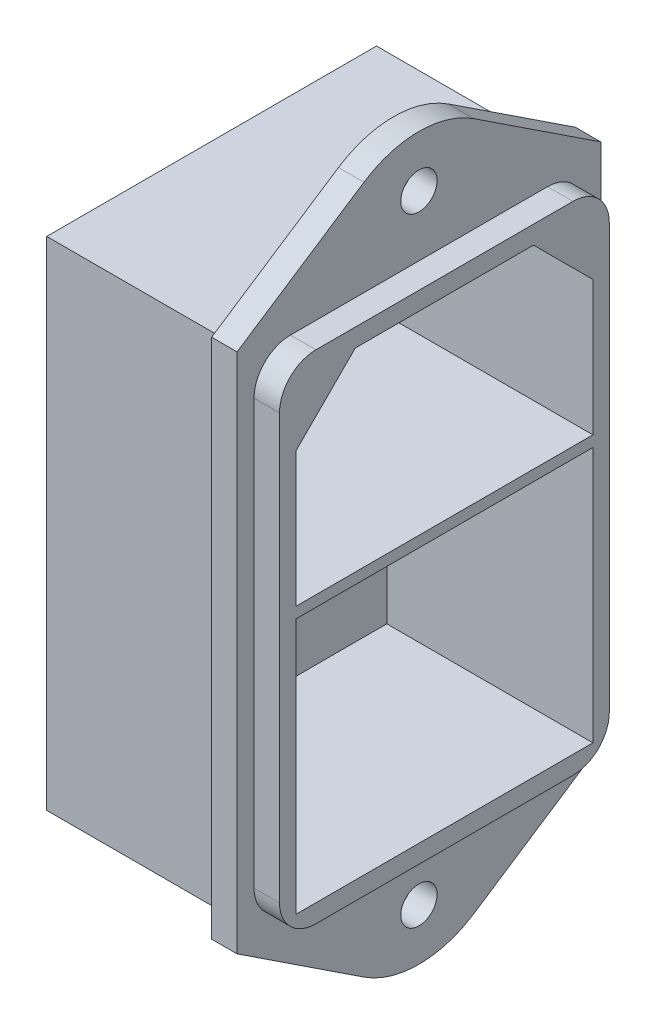
ISO-10303-21;
HEADER;
FILE_DESCRIPTION(('STEP AP214'),'2;1');
FILE_NAME('part.step','',(''),(''),'','','');
FILE_SCHEMA(('AUTOMOTIVE_DESIGN { 1 0 10303 214 1 1 1 1 }'));
ENDSEC;
DATA;
#1=APPLICATION_CONTEXT('core data for automotive mechanical design processes');
#2=APPLICATION_PROTOCOL_DEFINITION('international standard','automotive_design',2000,#1);
#3=PRODUCT_CONTEXT('',#1,'mechanical');
#4=PRODUCT('Part','Part','',(#3));
#5=PRODUCT_RELATED_PRODUCT_CATEGORY('part','',(#4));
#6=PRODUCT_DEFINITION_FORMATION('','',#4);
#7=PRODUCT_DEFINITION_CONTEXT('part definition',#1,'design');
#8=PRODUCT_DEFINITION('design','',#6,#7);
#9=PRODUCT_DEFINITION_SHAPE('','',#8);
#10=(LENGTH_UNIT() NAMED_UNIT(*) SI_UNIT(.MILLI.,.METRE.));
#11=(NAMED_UNIT(*) PLANE_ANGLE_UNIT() SI_UNIT($,.RADIAN.));
#12=(NAMED_UNIT(*) SI_UNIT($,.STERADIAN.) SOLID_ANGLE_UNIT());
#13=UNCERTAINTY_MEASURE_WITH_UNIT(LENGTH_MEASURE(1.E-05),#10,'distance_accuracy_value','');
#14=(GEOMETRIC_REPRESENTATION_CONTEXT(3) GLOBAL_UNCERTAINTY_ASSIGNED_CONTEXT((#13)) GLOBAL_UNIT_ASSIGNED_CONTEXT((#10,
#11,#12)) REPRESENTATION_CONTEXT('',''));
#15=CARTESIAN_POINT('',(0.,0.,0.));
#16=DIRECTION('',(0.,0.,1.));
#17=DIRECTION('',(1.,0.,0.));
#18=AXIS2_PLACEMENT_3D('',#15,#16,#17);
#19=CARTESIAN_POINT('',(2.1,2.09999999999999,0.));
#20=DIRECTION('',(0.,1.,0.));
#21=DIRECTION('',(0.,0.,1.));
#22=AXIS2_PLACEMENT_3D('',#19,#20,#21);
#23=PLANE('',#22);
#24=DIRECTION('',(0.,0.,1.));
#25=VECTOR('',#24,1.);
#26=CARTESIAN_POINT('',(-12.8,2.09999999999999,0.));
#27=LINE('',#26,#25);
#28=CARTESIAN_POINT('',(-12.8,2.09999999999999,-12.25));
#29=VERTEX_POINT('',#28);
#30=CARTESIAN_POINT('',(-12.8,2.09999999999999,12.25));
#31=VERTEX_POINT('',#30);
#32=EDGE_CURVE('E106',#29,#31,#27,.T.);
#33=ORIENTED_EDGE('',*,*,#32,.F.);
#34=DIRECTION('',(-1.,0.,0.));
#35=VECTOR('',#34,1.);
#36=CARTESIAN_POINT('',(2.1,2.09999999999999,-12.25));
#37=LINE('',#36,#35);
#38=CARTESIAN_POINT('',(4.2,2.09999999999999,-12.25));
#39=VERTEX_POINT('',#38);
#40=EDGE_CURVE('E296',#39,#29,#37,.T.);
#41=ORIENTED_EDGE('',*,*,#40,.F.);
#42=DIRECTION('',(0.,0.,1.));
#43=VECTOR('',#42,1.);
#44=CARTESIAN_POINT('',(4.2,2.09999999999999,0.));
#45=LINE('',#44,#43);
#46=CARTESIAN_POINT('',(4.2,2.09999999999999,12.25));
#47=VERTEX_POINT('',#46);
#48=EDGE_CURVE('E562',#39,#47,#45,.T.);
#49=ORIENTED_EDGE('',*,*,#48,.T.);
#50=DIRECTION('',(-1.,0.,0.));
#51=VECTOR('',#50,1.);
#52=CARTESIAN_POINT('',(2.1,2.09999999999999,12.25));
#53=LINE('',#52,#51);
#54=EDGE_CURVE('E298',#47,#31,#53,.T.);
#55=ORIENTED_EDGE('',*,*,#54,.T.);
#56=EDGE_LOOP('',(#33,#41,#49,#55));
#57=FACE_BOUND('',#56,.T.);
#58=ADVANCED_FACE('F91',(#57),#23,.F.);
#59=CARTESIAN_POINT('',(2.1,0.,-12.25));
#60=DIRECTION('',(0.,0.,-1.));
#61=DIRECTION('',(-1.,0.,0.));
#62=AXIS2_PLACEMENT_3D('',#59,#60,#61);
#63=PLANE('',#62);
#64=DIRECTION('',(0.,1.,0.));
#65=VECTOR('',#64,1.);
#66=CARTESIAN_POINT('',(-12.8,0.,-12.25));
#67=LINE('',#66,#65);
#68=CARTESIAN_POINT('',(-12.8,-19.,-12.25));
#69=VERTEX_POINT('',#68);
#70=EDGE_CURVE('E285',#69,#29,#67,.T.);
#71=ORIENTED_EDGE('',*,*,#70,.F.);
#72=DIRECTION('',(-1.,0.,0.));
#73=VECTOR('',#72,1.);
#74=CARTESIAN_POINT('',(2.1,-19.,-12.25));
#75=LINE('',#74,#73);
#76=CARTESIAN_POINT('',(4.2,-19.,-12.25));
#77=VERTEX_POINT('',#76);
#78=EDGE_CURVE('E307',#77,#69,#75,.T.);
#79=ORIENTED_EDGE('',*,*,#78,.F.);
#80=DIRECTION('',(0.,1.,0.));
#81=VECTOR('',#80,1.);
#82=CARTESIAN_POINT('',(4.2,0.,-12.25));
#83=LINE('',#82,#81);
#84=EDGE_CURVE('E304',#77,#39,#83,.T.);
#85=ORIENTED_EDGE('',*,*,#84,.T.);
#86=ORIENTED_EDGE('',*,*,#40,.T.);
#87=EDGE_LOOP('',(#71,#79,#85,#86));
#88=FACE_BOUND('',#87,.T.);
#89=ADVANCED_FACE('F302',(#88),#63,.F.);
#90=CARTESIAN_POINT('',(2.1,-19.,0.));
#91=DIRECTION('',(0.,1.,0.));
#92=DIRECTION('',(0.,0.,1.));
#93=AXIS2_PLACEMENT_3D('',#90,#91,#92);
#94=PLANE('',#93);
#95=ORIENTED_EDGE('',*,*,#78,.T.);
#96=DIRECTION('',(0.,0.,1.));
#97=VECTOR('',#96,1.);
#98=CARTESIAN_POINT('',(-12.8,-19.,0.));
#99=LINE('',#98,#97);
#100=CARTESIAN_POINT('',(-12.8,-19.,12.25));
#101=VERTEX_POINT('',#100);
#102=EDGE_CURVE('E288',#69,#101,#99,.T.);
#103=ORIENTED_EDGE('',*,*,#102,.T.);
#104=DIRECTION('',(-1.,0.,0.));
#105=VECTOR('',#104,1.);
#106=CARTESIAN_POINT('',(2.1,-19.,12.25));
#107=LINE('',#106,#105);
#108=CARTESIAN_POINT('',(4.2,-19.,12.25));
#109=VERTEX_POINT('',#108);
#110=EDGE_CURVE('E311',#109,#101,#107,.T.);
#111=ORIENTED_EDGE('',*,*,#110,.F.);
#112=DIRECTION('',(0.,0.,1.));
#113=VECTOR('',#112,1.);
#114=CARTESIAN_POINT('',(4.2,-19.,0.));
#115=LINE('',#114,#113);
#116=EDGE_CURVE('E399',#77,#109,#115,.T.);
#117=ORIENTED_EDGE('',*,*,#116,.F.);
#118=EDGE_LOOP('',(#95,#103,#111,#117));
#119=FACE_BOUND('',#118,.T.);
#120=ADVANCED_FACE('F493',(#119),#94,.T.);
#121=CARTESIAN_POINT('',(2.1,0.,12.25));
#122=DIRECTION('',(0.,0.,-1.));
#123=DIRECTION('',(0.,1.,0.));
#124=AXIS2_PLACEMENT_3D('',#121,#122,#123);
#125=PLANE('',#124);
#126=ORIENTED_EDGE('',*,*,#110,.T.);
#127=DIRECTION('',(0.,1.,0.));
#128=VECTOR('',#127,1.);
#129=CARTESIAN_POINT('',(-12.8,0.,12.25));
#130=LINE('',#129,#128);
#131=EDGE_CURVE('E300',#101,#31,#130,.T.);
#132=ORIENTED_EDGE('',*,*,#131,.T.);
#133=ORIENTED_EDGE('',*,*,#54,.F.);
#134=DIRECTION('',(0.,1.,0.));
#135=VECTOR('',#134,1.);
#136=CARTESIAN_POINT('',(4.2,0.,12.25));
#137=LINE('',#136,#135);
#138=EDGE_CURVE('E489',#109,#47,#137,.T.);
#139=ORIENTED_EDGE('',*,*,#138,.F.);
#140=EDGE_LOOP('',(#126,#132,#133,#139));
#141=FACE_BOUND('',#140,.T.);
#142=ADVANCED_FACE('F487',(#141),#125,.T.);
#143=CARTESIAN_POINT('',(2.1,0.,12.25));
#144=DIRECTION('',(0.,0.,-1.));
#145=DIRECTION('',(0.,1.,0.));
#146=AXIS2_PLACEMENT_3D('',#143,#144,#145);
#147=PLANE('',#146);
#148=DIRECTION('',(-1.,0.,0.));
#149=VECTOR('',#148,1.);
#150=CARTESIAN_POINT('',(2.1,2.99999999999999,12.25));
#151=LINE('',#150,#149);
#152=CARTESIAN_POINT('',(4.2,2.99999999999999,12.25));
#153=VERTEX_POINT('',#152);
#154=CARTESIAN_POINT('',(-12.8,2.99999999999999,12.25));
#155=VERTEX_POINT('',#154);
#156=EDGE_CURVE('E315',#153,#155,#151,.T.);
#157=ORIENTED_EDGE('',*,*,#156,.T.);
#158=DIRECTION('',(0.,1.,0.));
#159=VECTOR('',#158,1.);
#160=CARTESIAN_POINT('',(-12.8,0.,12.25));
#161=LINE('',#160,#159);
#162=CARTESIAN_POINT('',(-12.8,14.1,12.25));
#163=VERTEX_POINT('',#162);
#164=EDGE_CURVE('E114',#155,#163,#161,.T.);
#165=ORIENTED_EDGE('',*,*,#164,.T.);
#166=DIRECTION('',(-1.,0.,0.));
#167=VECTOR('',#166,1.);
#168=CARTESIAN_POINT('',(2.1,14.1,12.25));
#169=LINE('',#168,#167);
#170=CARTESIAN_POINT('',(4.2,14.1,12.25));
#171=VERTEX_POINT('',#170);
#172=EDGE_CURVE('E331',#171,#163,#169,.T.);
#173=ORIENTED_EDGE('',*,*,#172,.F.);
#174=DIRECTION('',(0.,1.,0.));
#175=VECTOR('',#174,1.);
#176=CARTESIAN_POINT('',(4.2,0.,12.25));
#177=LINE('',#176,#175);
#178=EDGE_CURVE('E549',#153,#171,#177,.T.);
#179=ORIENTED_EDGE('',*,*,#178,.F.);
#180=EDGE_LOOP('',(#157,#165,#173,#179));
#181=FACE_BOUND('',#180,.T.);
#182=ADVANCED_FACE('F620',(#181),#147,.T.);
#183=CARTESIAN_POINT('',(2.1,13.175,13.175));
#184=DIRECTION('',(0.,-0.707106781186547,-0.707106781186548));
#185=DIRECTION('',(0.,0.707106781186548,-0.707106781186547));
#186=AXIS2_PLACEMENT_3D('',#183,#184,#185);
#187=PLANE('',#186);
#188=ORIENTED_EDGE('',*,*,#172,.T.);
#189=DIRECTION('',(0.,0.707106781186548,-0.707106781186547));
#190=VECTOR('',#189,1.);
#191=CARTESIAN_POINT('',(-12.8,13.175,13.175));
#192=LINE('',#191,#190);
#193=CARTESIAN_POINT('',(-12.8,19.,7.35000000000001));
#194=VERTEX_POINT('',#193);
#195=EDGE_CURVE('E503',#163,#194,#192,.T.);
#196=ORIENTED_EDGE('',*,*,#195,.T.);
#197=DIRECTION('',(-1.,0.,0.));
#198=VECTOR('',#197,1.);
#199=CARTESIAN_POINT('',(2.1,19.,7.35000000000001));
#200=LINE('',#199,#198);
#201=CARTESIAN_POINT('',(4.2,19.,7.35000000000001));
#202=VERTEX_POINT('',#201);
#203=EDGE_CURVE('E328',#202,#194,#200,.T.);
#204=ORIENTED_EDGE('',*,*,#203,.F.);
#205=DIRECTION('',(0.,0.707106781186548,-0.707106781186547));
#206=VECTOR('',#205,1.);
#207=CARTESIAN_POINT('',(4.2,13.175,13.175));
#208=LINE('',#207,#206);
#209=EDGE_CURVE('E552',#171,#202,#208,.T.);
#210=ORIENTED_EDGE('',*,*,#209,.F.);
#211=EDGE_LOOP('',(#188,#196,#204,#210));
#212=FACE_BOUND('',#211,.T.);
#213=ADVANCED_FACE('F616',(#212),#187,.T.);
#214=CARTESIAN_POINT('',(2.1,19.,0.));
#215=DIRECTION('',(0.,-1.,0.));
#216=DIRECTION('',(0.,0.,-1.));
#217=AXIS2_PLACEMENT_3D('',#214,#215,#216);
#218=PLANE('',#217);
#219=ORIENTED_EDGE('',*,*,#203,.T.);
#220=DIRECTION('',(0.,0.,-1.));
#221=VECTOR('',#220,1.);
#222=CARTESIAN_POINT('',(-12.8,19.,0.));
#223=LINE('',#222,#221);
#224=CARTESIAN_POINT('',(-12.8,19.,-7.35));
#225=VERTEX_POINT('',#224);
#226=EDGE_CURVE('E506',#194,#225,#223,.T.);
#227=ORIENTED_EDGE('',*,*,#226,.T.);
#228=DIRECTION('',(-1.,0.,0.));
#229=VECTOR('',#228,1.);
#230=CARTESIAN_POINT('',(2.1,19.,-7.35));
#231=LINE('',#230,#229);
#232=CARTESIAN_POINT('',(4.2,19.,-7.35));
#233=VERTEX_POINT('',#232);
#234=EDGE_CURVE('E325',#233,#225,#231,.T.);
#235=ORIENTED_EDGE('',*,*,#234,.F.);
#236=DIRECTION('',(0.,0.,-1.));
#237=VECTOR('',#236,1.);
#238=CARTESIAN_POINT('',(4.2,19.,0.));
#239=LINE('',#238,#237);
#240=EDGE_CURVE('E555',#202,#233,#239,.T.);
#241=ORIENTED_EDGE('',*,*,#240,.F.);
#242=EDGE_LOOP('',(#219,#227,#235,#241));
#243=FACE_BOUND('',#242,.T.);
#244=ADVANCED_FACE('F612',(#243),#218,.T.);
#245=CARTESIAN_POINT('',(2.1,13.175,-13.175));
#246=DIRECTION('',(0.,-0.707106781186548,0.707106781186548));
#247=DIRECTION('',(0.,-0.707106781186548,-0.707106781186548));
#248=AXIS2_PLACEMENT_3D('',#245,#246,#247);
#249=PLANE('',#248);
#250=ORIENTED_EDGE('',*,*,#234,.T.);
#251=DIRECTION('',(0.,-0.707106781186548,-0.707106781186548));
#252=VECTOR('',#251,1.);
#253=CARTESIAN_POINT('',(-12.8,13.175,-13.175));
#254=LINE('',#253,#252);
#255=CARTESIAN_POINT('',(-12.8,14.1,-12.25));
#256=VERTEX_POINT('',#255);
#257=EDGE_CURVE('E299',#225,#256,#254,.T.);
#258=ORIENTED_EDGE('',*,*,#257,.T.);
#259=DIRECTION('',(-1.,0.,0.));
#260=VECTOR('',#259,1.);
#261=CARTESIAN_POINT('',(2.1,14.1,-12.25));
#262=LINE('',#261,#260);
#263=CARTESIAN_POINT('',(4.2,14.1,-12.25));
#264=VERTEX_POINT('',#263);
#265=EDGE_CURVE('E322',#264,#256,#262,.T.);
#266=ORIENTED_EDGE('',*,*,#265,.F.);
#267=DIRECTION('',(0.,-0.707106781186548,-0.707106781186548));
#268=VECTOR('',#267,1.);
#269=CARTESIAN_POINT('',(4.2,13.175,-13.175));
#270=LINE('',#269,#268);
#271=EDGE_CURVE('E558',#233,#264,#270,.T.);
#272=ORIENTED_EDGE('',*,*,#271,.F.);
#273=EDGE_LOOP('',(#250,#258,#266,#272));
#274=FACE_BOUND('',#273,.T.);
#275=ADVANCED_FACE('F608',(#274),#249,.T.);
#276=CARTESIAN_POINT('',(2.1,0.,-12.25));
#277=DIRECTION('',(0.,0.,1.));
#278=DIRECTION('',(0.,-1.,0.));
#279=AXIS2_PLACEMENT_3D('',#276,#277,#278);
#280=PLANE('',#279);
#281=ORIENTED_EDGE('',*,*,#265,.T.);
#282=DIRECTION('',(0.,-1.,0.));
#283=VECTOR('',#282,1.);
#284=CARTESIAN_POINT('',(-12.8,0.,-12.25));
#285=LINE('',#284,#283);
#286=CARTESIAN_POINT('',(-12.8,2.99999999999999,-12.25));
#287=VERTEX_POINT('',#286);
#288=EDGE_CURVE('E497',#256,#287,#285,.T.);
#289=ORIENTED_EDGE('',*,*,#288,.T.);
#290=DIRECTION('',(-1.,0.,0.));
#291=VECTOR('',#290,1.);
#292=CARTESIAN_POINT('',(2.1,2.99999999999999,-12.25));
#293=LINE('',#292,#291);
#294=CARTESIAN_POINT('',(4.2,2.99999999999999,-12.25));
#295=VERTEX_POINT('',#294);
#296=EDGE_CURVE('E318',#295,#287,#293,.T.);
#297=ORIENTED_EDGE('',*,*,#296,.F.);
#298=DIRECTION('',(0.,-1.,0.));
#299=VECTOR('',#298,1.);
#300=CARTESIAN_POINT('',(4.2,0.,-12.25));
#301=LINE('',#300,#299);
#302=EDGE_CURVE('E535',#264,#295,#301,.T.);
#303=ORIENTED_EDGE('',*,*,#302,.F.);
#304=EDGE_LOOP('',(#281,#289,#297,#303));
#305=FACE_BOUND('',#304,.T.);
#306=ADVANCED_FACE('F604',(#305),#280,.T.);
#307=CARTESIAN_POINT('',(2.1,2.99999999999999,0.));
#308=DIRECTION('',(0.,1.,0.));
#309=DIRECTION('',(0.,0.,1.));
#310=AXIS2_PLACEMENT_3D('',#307,#308,#309);
#311=PLANE('',#310);
#312=ORIENTED_EDGE('',*,*,#296,.T.);
#313=DIRECTION('',(0.,0.,1.));
#314=VECTOR('',#313,1.);
#315=CARTESIAN_POINT('',(-12.8,2.99999999999999,0.));
#316=LINE('',#315,#314);
#317=EDGE_CURVE('E500',#287,#155,#316,.T.);
#318=ORIENTED_EDGE('',*,*,#317,.T.);
#319=ORIENTED_EDGE('',*,*,#156,.F.);
#320=DIRECTION('',(0.,0.,1.));
#321=VECTOR('',#320,1.);
#322=CARTESIAN_POINT('',(4.2,2.99999999999999,0.));
#323=LINE('',#322,#321);
#324=EDGE_CURVE('E546',#295,#153,#323,.T.);
#325=ORIENTED_EDGE('',*,*,#324,.F.);
#326=EDGE_LOOP('',(#312,#318,#319,#325));
#327=FACE_BOUND('',#326,.T.);
#328=ADVANCED_FACE('F600',(#327),#311,.T.);
#329=CARTESIAN_POINT('',(0.,0.,0.));
#330=DIRECTION('',(1.,0.,0.));
#331=DIRECTION('',(0.,0.,-1.));
#332=AXIS2_PLACEMENT_3D('',#329,#330,#331);
#333=PLANE('',#332);
#334=CARTESIAN_POINT('',(0.,-25.5,0.));
#335=DIRECTION('',(1.,0.,0.));
#336=DIRECTION('',(0.,0.,-1.));
#337=AXIS2_PLACEMENT_3D('',#334,#335,#336);
#338=CIRCLE('',#337,1.5);
#339=CARTESIAN_POINT('',(0.,-25.5,-1.5));
#340=VERTEX_POINT('',#339);
#341=EDGE_CURVE('E434',#340,#340,#338,.F.);
#342=ORIENTED_EDGE('',*,*,#341,.F.);
#343=EDGE_LOOP('',(#342));
#344=FACE_BOUND('',#343,.T.);
#345=CARTESIAN_POINT('',(0.,21.5,0.));
#346=DIRECTION('',(1.,0.,0.));
#347=DIRECTION('',(0.,0.,-1.));
#348=AXIS2_PLACEMENT_3D('',#345,#346,#347);
#349=CIRCLE('',#348,8.25000000000001);
#350=CARTESIAN_POINT('',(0.,28.3901083990021,4.53750000000002));
#351=VERTEX_POINT('',#350);
#352=CARTESIAN_POINT('',(0.,28.3901083990021,-4.53749999999999));
#353=VERTEX_POINT('',#352);
#354=EDGE_CURVE('E418',#351,#353,#349,.F.);
#355=ORIENTED_EDGE('',*,*,#354,.T.);
#356=DIRECTION('',(0.,-0.55,-0.835164654424504));
#357=VECTOR('',#356,1.);
#358=CARTESIAN_POINT('',(0.,21.8863583990021,-14.4133220385697));
#359=LINE('',#358,#357);
#360=CARTESIAN_POINT('',(0.,21.5,-15.));
#361=VERTEX_POINT('',#360);
#362=EDGE_CURVE('E479',#353,#361,#359,.T.);
#363=ORIENTED_EDGE('',*,*,#362,.T.);
#364=DIRECTION('',(0.,-1.,0.));
#365=VECTOR('',#364,1.);
#366=CARTESIAN_POINT('',(0.,0.,-15.));
#367=LINE('',#366,#365);
#368=CARTESIAN_POINT('',(0.,-21.5,-15.));
#369=VERTEX_POINT('',#368);
#370=EDGE_CURVE('E476',#361,#369,#367,.T.);
#371=ORIENTED_EDGE('',*,*,#370,.T.);
#372=DIRECTION('',(0.,0.549999999999999,-0.835164654424504));
#373=VECTOR('',#372,1.);
#374=CARTESIAN_POINT('',(0.,-21.8863583990022,-14.4133220385697));
#375=LINE('',#374,#373);
#376=CARTESIAN_POINT('',(0.,-28.3901083990022,-4.53749999999999));
#377=VERTEX_POINT('',#376);
#378=EDGE_CURVE('E473',#377,#369,#375,.T.);
#379=ORIENTED_EDGE('',*,*,#378,.F.);
#380=CARTESIAN_POINT('',(0.,-21.5,0.));
#381=DIRECTION('',(1.,0.,0.));
#382=DIRECTION('',(0.,0.,-1.));
#383=AXIS2_PLACEMENT_3D('',#380,#381,#382);
#384=CIRCLE('',#383,8.25000000000001);
#385=CARTESIAN_POINT('',(0.,-28.3901083990022,4.53750000000002));
#386=VERTEX_POINT('',#385);
#387=EDGE_CURVE('E470',#386,#377,#384,.T.);
#388=ORIENTED_EDGE('',*,*,#387,.F.);
#389=DIRECTION('',(0.,-0.550000000000002,-0.835164654424502));
#390=VECTOR('',#389,1.);
#391=CARTESIAN_POINT('',(0.,-21.8863583990021,14.4133220385698));
#392=LINE('',#391,#390);
#393=CARTESIAN_POINT('',(0.,-21.5,15.));
#394=VERTEX_POINT('',#393);
#395=EDGE_CURVE('E467',#394,#386,#392,.T.);
#396=ORIENTED_EDGE('',*,*,#395,.F.);
#397=DIRECTION('',(0.,-1.,0.));
#398=VECTOR('',#397,1.);
#399=CARTESIAN_POINT('',(0.,0.,15.));
#400=LINE('',#399,#398);
#401=CARTESIAN_POINT('',(0.,21.5,15.));
#402=VERTEX_POINT('',#401);
#403=EDGE_CURVE('E464',#402,#394,#400,.T.);
#404=ORIENTED_EDGE('',*,*,#403,.F.);
#405=DIRECTION('',(0.,0.550000000000002,-0.835164654424502));
#406=VECTOR('',#405,1.);
#407=CARTESIAN_POINT('',(0.,21.8863583990021,14.4133220385698));
#408=LINE('',#407,#406);
#409=EDGE_CURVE('E461',#402,#351,#408,.T.);
#410=ORIENTED_EDGE('',*,*,#409,.T.);
#411=EDGE_LOOP('',(#355,#363,#371,#379,#388,#396,#404,#410));
#412=FACE_BOUND('',#411,.T.);
#413=CARTESIAN_POINT('',(0.,25.5,0.));
#414=DIRECTION('',(1.,0.,0.));
#415=DIRECTION('',(0.,0.,-1.));
#416=AXIS2_PLACEMENT_3D('',#413,#414,#415);
#417=CIRCLE('',#416,1.5);
#418=CARTESIAN_POINT('',(0.,25.5,-1.5));
#419=VERTEX_POINT('',#418);
#420=EDGE_CURVE('E414',#419,#419,#417,.T.);
#421=ORIENTED_EDGE('',*,*,#420,.T.);
#422=EDGE_LOOP('',(#421));
#423=FACE_BOUND('',#422,.T.);
#424=DIRECTION('',(0.,-1.,0.));
#425=VECTOR('',#424,1.);
#426=CARTESIAN_POINT('',(0.,0.,-13.6));
#427=LINE('',#426,#425);
#428=CARTESIAN_POINT('',(0.,20.5,-13.6));
#429=VERTEX_POINT('',#428);
#430=CARTESIAN_POINT('',(0.,-20.5,-13.6));
#431=VERTEX_POINT('',#430);
#432=EDGE_CURVE('E509',#429,#431,#427,.T.);
#433=ORIENTED_EDGE('',*,*,#432,.F.);
#434=DIRECTION('',(0.,0.,-1.));
#435=VECTOR('',#434,1.);
#436=CARTESIAN_POINT('',(0.,20.5,0.));
#437=LINE('',#436,#435);
#438=CARTESIAN_POINT('',(0.,20.5,13.6));
#439=VERTEX_POINT('',#438);
#440=EDGE_CURVE('E526',#439,#429,#437,.T.);
#441=ORIENTED_EDGE('',*,*,#440,.F.);
#442=DIRECTION('',(0.,-1.,0.));
#443=VECTOR('',#442,1.);
#444=CARTESIAN_POINT('',(0.,0.,13.6));
#445=LINE('',#444,#443);
#446=CARTESIAN_POINT('',(0.,-20.5,13.6));
#447=VERTEX_POINT('',#446);
#448=EDGE_CURVE('E529',#439,#447,#445,.T.);
#449=ORIENTED_EDGE('',*,*,#448,.T.);
#450=DIRECTION('',(0.,0.,-1.));
#451=VECTOR('',#450,1.);
#452=CARTESIAN_POINT('',(0.,-20.5,0.));
#453=LINE('',#452,#451);
#454=EDGE_CURVE('E515',#447,#431,#453,.T.);
#455=ORIENTED_EDGE('',*,*,#454,.T.);
#456=EDGE_LOOP('',(#433,#441,#449,#455));
#457=FACE_BOUND('',#456,.T.);
#458=ADVANCED_FACE('F603',(#344,#412,#423,#457),#333,.F.);
#459=CARTESIAN_POINT('',(2.1,21.5,0.));
#460=DIRECTION('',(-1.,0.,0.));
#461=DIRECTION('',(0.,0.,1.));
#462=AXIS2_PLACEMENT_3D('',#459,#460,#461);
#463=CYLINDRICAL_SURFACE('',#462,8.25000000000001);
#464=ORIENTED_EDGE('',*,*,#354,.F.);
#465=DIRECTION('',(-1.,0.,0.));
#466=VECTOR('',#465,1.);
#467=CARTESIAN_POINT('',(2.1,28.3901083990021,4.53750000000002));
#468=LINE('',#467,#466);
#469=CARTESIAN_POINT('',(2.1,28.3901083990021,4.53750000000002));
#470=VERTEX_POINT('',#469);
#471=EDGE_CURVE('E319',#470,#351,#468,.T.);
#472=ORIENTED_EDGE('',*,*,#471,.F.);
#473=CARTESIAN_POINT('',(2.1,21.5,0.));
#474=DIRECTION('',(1.,0.,0.));
#475=DIRECTION('',(0.,0.,-1.));
#476=AXIS2_PLACEMENT_3D('',#473,#474,#475);
#477=CIRCLE('',#476,8.25000000000001);
#478=CARTESIAN_POINT('',(2.1,28.3901083990021,-4.53749999999999));
#479=VERTEX_POINT('',#478);
#480=EDGE_CURVE('E433',#470,#479,#477,.F.);
#481=ORIENTED_EDGE('',*,*,#480,.T.);
#482=DIRECTION('',(-1.,0.,0.));
#483=VECTOR('',#482,1.);
#484=CARTESIAN_POINT('',(2.1,28.3901083990021,-4.53749999999999));
#485=LINE('',#484,#483);
#486=EDGE_CURVE('E334',#479,#353,#485,.T.);
#487=ORIENTED_EDGE('',*,*,#486,.T.);
#488=EDGE_LOOP('',(#464,#472,#481,#487));
#489=FACE_BOUND('',#488,.T.);
#490=ADVANCED_FACE('F653',(#489),#463,.T.);
#491=CARTESIAN_POINT('',(2.1,21.8863583990021,14.4133220385698));
#492=DIRECTION('',(0.,0.835164654424502,0.550000000000002));
#493=DIRECTION('',(0.,-0.550000000000002,0.835164654424502));
#494=AXIS2_PLACEMENT_3D('',#491,#492,#493);
#495=PLANE('',#494);
#496=ORIENTED_EDGE('',*,*,#409,.F.);
#497=DIRECTION('',(-1.,0.,0.));
#498=VECTOR('',#497,1.);
#499=CARTESIAN_POINT('',(2.1,21.5,15.));
#500=LINE('',#499,#498);
#501=CARTESIAN_POINT('',(2.1,21.5,15.));
#502=VERTEX_POINT('',#501);
#503=EDGE_CURVE('E350',#502,#402,#500,.T.);
#504=ORIENTED_EDGE('',*,*,#503,.F.);
#505=DIRECTION('',(0.,0.550000000000002,-0.835164654424502));
#506=VECTOR('',#505,1.);
#507=CARTESIAN_POINT('',(2.1,21.8863583990021,14.4133220385698));
#508=LINE('',#507,#506);
#509=EDGE_CURVE('E437',#502,#470,#508,.T.);
#510=ORIENTED_EDGE('',*,*,#509,.T.);
#511=ORIENTED_EDGE('',*,*,#471,.T.);
#512=EDGE_LOOP('',(#496,#504,#510,#511));
#513=FACE_BOUND('',#512,.T.);
#514=ADVANCED_FACE('F649',(#513),#495,.T.);
#515=CARTESIAN_POINT('',(2.1,0.,15.));
#516=DIRECTION('',(0.,0.,-1.));
#517=DIRECTION('',(0.,1.,0.));
#518=AXIS2_PLACEMENT_3D('',#515,#516,#517);
#519=PLANE('',#518);
#520=ORIENTED_EDGE('',*,*,#403,.T.);
#521=DIRECTION('',(-1.,0.,0.));
#522=VECTOR('',#521,1.);
#523=CARTESIAN_POINT('',(2.1,-21.5,15.));
#524=LINE('',#523,#522);
#525=CARTESIAN_POINT('',(2.1,-21.5,15.));
#526=VERTEX_POINT('',#525);
#527=EDGE_CURVE('E347',#526,#394,#524,.T.);
#528=ORIENTED_EDGE('',*,*,#527,.F.);
#529=DIRECTION('',(0.,-1.,0.));
#530=VECTOR('',#529,1.);
#531=CARTESIAN_POINT('',(2.1,0.,15.));
#532=LINE('',#531,#530);
#533=EDGE_CURVE('E440',#502,#526,#532,.T.);
#534=ORIENTED_EDGE('',*,*,#533,.F.);
#535=ORIENTED_EDGE('',*,*,#503,.T.);
#536=EDGE_LOOP('',(#520,#528,#534,#535));
#537=FACE_BOUND('',#536,.T.);
#538=ADVANCED_FACE('F645',(#537),#519,.F.);
#539=CARTESIAN_POINT('',(2.1,-21.8863583990021,14.4133220385698));
#540=DIRECTION('',(0.,0.835164654424502,-0.550000000000002));
#541=DIRECTION('',(0.,0.550000000000002,0.835164654424502));
#542=AXIS2_PLACEMENT_3D('',#539,#540,#541);
#543=PLANE('',#542);
#544=ORIENTED_EDGE('',*,*,#395,.T.);
#545=DIRECTION('',(-1.,0.,0.));
#546=VECTOR('',#545,1.);
#547=CARTESIAN_POINT('',(2.1,-28.3901083990022,4.53750000000002));
#548=LINE('',#547,#546);
#549=CARTESIAN_POINT('',(2.1,-28.3901083990022,4.53750000000002));
#550=VERTEX_POINT('',#549);
#551=EDGE_CURVE('E344',#550,#386,#548,.T.);
#552=ORIENTED_EDGE('',*,*,#551,.F.);
#553=DIRECTION('',(0.,-0.550000000000002,-0.835164654424502));
#554=VECTOR('',#553,1.);
#555=CARTESIAN_POINT('',(2.1,-21.8863583990021,14.4133220385698));
#556=LINE('',#555,#554);
#557=EDGE_CURVE('E443',#526,#550,#556,.T.);
#558=ORIENTED_EDGE('',*,*,#557,.F.);
#559=ORIENTED_EDGE('',*,*,#527,.T.);
#560=EDGE_LOOP('',(#544,#552,#558,#559));
#561=FACE_BOUND('',#560,.T.);
#562=ADVANCED_FACE('F641',(#561),#543,.F.);
#563=CARTESIAN_POINT('',(2.1,-21.5,0.));
#564=DIRECTION('',(-1.,0.,0.));
#565=DIRECTION('',(0.,0.,1.));
#566=AXIS2_PLACEMENT_3D('',#563,#564,#565);
#567=CYLINDRICAL_SURFACE('',#566,8.25000000000001);
#568=ORIENTED_EDGE('',*,*,#387,.T.);
#569=DIRECTION('',(-1.,0.,0.));
#570=VECTOR('',#569,1.);
#571=CARTESIAN_POINT('',(2.1,-28.3901083990022,-4.53749999999999));
#572=LINE('',#571,#570);
#573=CARTESIAN_POINT('',(2.1,-28.3901083990022,-4.53749999999999));
#574=VERTEX_POINT('',#573);
#575=EDGE_CURVE('E341',#574,#377,#572,.T.);
#576=ORIENTED_EDGE('',*,*,#575,.F.);
#577=CARTESIAN_POINT('',(2.1,-21.5,0.));
#578=DIRECTION('',(1.,0.,0.));
#579=DIRECTION('',(0.,0.,-1.));
#580=AXIS2_PLACEMENT_3D('',#577,#578,#579);
#581=CIRCLE('',#580,8.25000000000001);
#582=EDGE_CURVE('E446',#550,#574,#581,.T.);
#583=ORIENTED_EDGE('',*,*,#582,.F.);
#584=ORIENTED_EDGE('',*,*,#551,.T.);
#585=EDGE_LOOP('',(#568,#576,#583,#584));
#586=FACE_BOUND('',#585,.T.);
#587=ADVANCED_FACE('F637',(#586),#567,.T.);
#588=CARTESIAN_POINT('',(2.1,-21.8863583990022,-14.4133220385697));
#589=DIRECTION('',(0.,0.835164654424504,0.549999999999999));
#590=DIRECTION('',(0.,-0.549999999999999,0.835164654424504));
#591=AXIS2_PLACEMENT_3D('',#588,#589,#590);
#592=PLANE('',#591);
#593=ORIENTED_EDGE('',*,*,#378,.T.);
#594=DIRECTION('',(-1.,0.,0.));
#595=VECTOR('',#594,1.);
#596=CARTESIAN_POINT('',(2.1,-21.5,-15.));
#597=LINE('',#596,#595);
#598=CARTESIAN_POINT('',(2.1,-21.5,-15.));
#599=VERTEX_POINT('',#598);
#600=EDGE_CURVE('E339',#599,#369,#597,.T.);
#601=ORIENTED_EDGE('',*,*,#600,.F.);
#602=DIRECTION('',(0.,0.549999999999999,-0.835164654424504));
#603=VECTOR('',#602,1.);
#604=CARTESIAN_POINT('',(2.1,-21.8863583990022,-14.4133220385697));
#605=LINE('',#604,#603);
#606=EDGE_CURVE('E449',#574,#599,#605,.T.);
#607=ORIENTED_EDGE('',*,*,#606,.F.);
#608=ORIENTED_EDGE('',*,*,#575,.T.);
#609=EDGE_LOOP('',(#593,#601,#607,#608));
#610=FACE_BOUND('',#609,.T.);
#611=ADVANCED_FACE('F633',(#610),#592,.F.);
#612=CARTESIAN_POINT('',(2.1,0.,-15.));
#613=DIRECTION('',(0.,0.,-1.));
#614=DIRECTION('',(0.,1.,0.));
#615=AXIS2_PLACEMENT_3D('',#612,#613,#614);
#616=PLANE('',#615);
#617=ORIENTED_EDGE('',*,*,#370,.F.);
#618=DIRECTION('',(-1.,0.,0.));
#619=VECTOR('',#618,1.);
#620=CARTESIAN_POINT('',(2.1,21.5,-15.));
#621=LINE('',#620,#619);
#622=CARTESIAN_POINT('',(2.1,21.5,-15.));
#623=VERTEX_POINT('',#622);
#624=EDGE_CURVE('E336',#623,#361,#621,.T.);
#625=ORIENTED_EDGE('',*,*,#624,.F.);
#626=DIRECTION('',(0.,-1.,0.));
#627=VECTOR('',#626,1.);
#628=CARTESIAN_POINT('',(2.1,0.,-15.));
#629=LINE('',#628,#627);
#630=EDGE_CURVE('E451',#623,#599,#629,.T.);
#631=ORIENTED_EDGE('',*,*,#630,.T.);
#632=ORIENTED_EDGE('',*,*,#600,.T.);
#633=EDGE_LOOP('',(#617,#625,#631,#632));
#634=FACE_BOUND('',#633,.T.);
#635=ADVANCED_FACE('F629',(#634),#616,.T.);
#636=CARTESIAN_POINT('',(2.1,21.8863583990021,-14.4133220385697));
#637=DIRECTION('',(0.,0.835164654424504,-0.55));
#638=DIRECTION('',(0.,0.55,0.835164654424504));
#639=AXIS2_PLACEMENT_3D('',#636,#637,#638);
#640=PLANE('',#639);
#641=ORIENTED_EDGE('',*,*,#362,.F.);
#642=ORIENTED_EDGE('',*,*,#486,.F.);
#643=DIRECTION('',(0.,-0.55,-0.835164654424504));
#644=VECTOR('',#643,1.);
#645=CARTESIAN_POINT('',(2.1,21.8863583990021,-14.4133220385697));
#646=LINE('',#645,#644);
#647=EDGE_CURVE('E454',#479,#623,#646,.T.);
#648=ORIENTED_EDGE('',*,*,#647,.T.);
#649=ORIENTED_EDGE('',*,*,#624,.T.);
#650=EDGE_LOOP('',(#641,#642,#648,#649));
#651=FACE_BOUND('',#650,.T.);
#652=ADVANCED_FACE('F625',(#651),#640,.T.);
#653=CARTESIAN_POINT('',(2.1,25.5,0.));
#654=DIRECTION('',(-1.,0.,0.));
#655=DIRECTION('',(0.,0.,1.));
#656=AXIS2_PLACEMENT_3D('',#653,#654,#655);
#657=CYLINDRICAL_SURFACE('',#656,1.5);
#658=CARTESIAN_POINT('',(2.1,25.5,0.));
#659=DIRECTION('',(1.,0.,0.));
#660=DIRECTION('',(0.,0.,-1.));
#661=AXIS2_PLACEMENT_3D('',#658,#659,#660);
#662=CIRCLE('',#661,1.5);
#663=CARTESIAN_POINT('',(2.1,25.5,-1.5));
#664=VERTEX_POINT('',#663);
#665=EDGE_CURVE('E430',#664,#664,#662,.T.);
#666=ORIENTED_EDGE('',*,*,#665,.T.);
#667=EDGE_LOOP('',(#666));
#668=FACE_BOUND('',#667,.T.);
#669=ORIENTED_EDGE('',*,*,#420,.F.);
#670=EDGE_LOOP('',(#669));
#671=FACE_BOUND('',#670,.T.);
#672=ADVANCED_FACE('F628',(#668,#671),#657,.F.);
#673=CARTESIAN_POINT('',(2.1,-25.5,0.));
#674=DIRECTION('',(-1.,0.,0.));
#675=DIRECTION('',(0.,0.,1.));
#676=AXIS2_PLACEMENT_3D('',#673,#674,#675);
#677=CYLINDRICAL_SURFACE('',#676,1.5);
#678=CARTESIAN_POINT('',(2.1,-25.5,0.));
#679=DIRECTION('',(1.,0.,0.));
#680=DIRECTION('',(0.,0.,-1.));
#681=AXIS2_PLACEMENT_3D('',#678,#679,#680);
#682=CIRCLE('',#681,1.5);
#683=CARTESIAN_POINT('',(2.1,-25.5,-1.5));
#684=VERTEX_POINT('',#683);
#685=EDGE_CURVE('E337',#684,#684,#682,.F.);
#686=ORIENTED_EDGE('',*,*,#685,.F.);
#687=EDGE_LOOP('',(#686));
#688=FACE_BOUND('',#687,.T.);
#689=ORIENTED_EDGE('',*,*,#341,.T.);
#690=EDGE_LOOP('',(#689));
#691=FACE_BOUND('',#690,.T.);
#692=ADVANCED_FACE('F659',(#688,#691),#677,.F.);
#693=CARTESIAN_POINT('',(2.1,0.,0.));
#694=DIRECTION('',(1.,0.,0.));
#695=DIRECTION('',(0.,0.,-1.));
#696=AXIS2_PLACEMENT_3D('',#693,#694,#695);
#697=PLANE('',#696);
#698=DIRECTION('',(0.,1.,0.));
#699=VECTOR('',#698,1.);
#700=CARTESIAN_POINT('',(2.1,0.,-13.6));
#701=LINE('',#700,#699);
#702=CARTESIAN_POINT('',(2.1,-17.5,-13.6));
#703=VERTEX_POINT('',#702);
#704=CARTESIAN_POINT('',(2.1,17.5,-13.6));
#705=VERTEX_POINT('',#704);
#706=EDGE_CURVE('E389',#703,#705,#701,.T.);
#707=ORIENTED_EDGE('',*,*,#706,.F.);
#708=CARTESIAN_POINT('',(2.1,-17.5,-10.6));
#709=DIRECTION('',(1.,0.,0.));
#710=DIRECTION('',(0.,0.,-1.));
#711=AXIS2_PLACEMENT_3D('',#708,#709,#710);
#712=CIRCLE('',#711,3.);
#713=CARTESIAN_POINT('',(2.1,-20.5,-10.6));
#714=VERTEX_POINT('',#713);
#715=EDGE_CURVE('E99',#703,#714,#712,.F.);
#716=ORIENTED_EDGE('',*,*,#715,.T.);
#717=DIRECTION('',(0.,0.,1.));
#718=VECTOR('',#717,1.);
#719=CARTESIAN_POINT('',(2.1,-20.5,0.));
#720=LINE('',#719,#718);
#721=CARTESIAN_POINT('',(2.1,-20.5,10.6));
#722=VERTEX_POINT('',#721);
#723=EDGE_CURVE('E387',#714,#722,#720,.T.);
#724=ORIENTED_EDGE('',*,*,#723,.T.);
#725=CARTESIAN_POINT('',(2.1,-17.5,10.6));
#726=DIRECTION('',(1.,0.,0.));
#727=DIRECTION('',(0.,0.,-1.));
#728=AXIS2_PLACEMENT_3D('',#725,#726,#727);
#729=CIRCLE('',#728,3.);
#730=CARTESIAN_POINT('',(2.1,-17.5,13.6));
#731=VERTEX_POINT('',#730);
#732=EDGE_CURVE('E13',#722,#731,#729,.F.);
#733=ORIENTED_EDGE('',*,*,#732,.T.);
#734=DIRECTION('',(0.,1.,0.));
#735=VECTOR('',#734,1.);
#736=CARTESIAN_POINT('',(2.1,0.,13.6));
#737=LINE('',#736,#735);
#738=CARTESIAN_POINT('',(2.1,17.5,13.6));
#739=VERTEX_POINT('',#738);
#740=EDGE_CURVE('E398',#731,#739,#737,.T.);
#741=ORIENTED_EDGE('',*,*,#740,.T.);
#742=CARTESIAN_POINT('',(2.1,17.5,10.6));
#743=DIRECTION('',(1.,0.,0.));
#744=DIRECTION('',(0.,0.,-1.));
#745=AXIS2_PLACEMENT_3D('',#742,#743,#744);
#746=CIRCLE('',#745,3.);
#747=CARTESIAN_POINT('',(2.1,20.5,10.6));
#748=VERTEX_POINT('',#747);
#749=EDGE_CURVE('E378',#739,#748,#746,.F.);
#750=ORIENTED_EDGE('',*,*,#749,.T.);
#751=DIRECTION('',(0.,0.,1.));
#752=VECTOR('',#751,1.);
#753=CARTESIAN_POINT('',(2.1,20.5,0.));
#754=LINE('',#753,#752);
#755=CARTESIAN_POINT('',(2.1,20.5,-10.6));
#756=VERTEX_POINT('',#755);
#757=EDGE_CURVE('E426',#756,#748,#754,.T.);
#758=ORIENTED_EDGE('',*,*,#757,.F.);
#759=CARTESIAN_POINT('',(2.1,17.5,-10.6));
#760=DIRECTION('',(1.,0.,0.));
#761=DIRECTION('',(0.,0.,-1.));
#762=AXIS2_PLACEMENT_3D('',#759,#760,#761);
#763=CIRCLE('',#762,3.);
#764=EDGE_CURVE('E380',#756,#705,#763,.F.);
#765=ORIENTED_EDGE('',*,*,#764,.T.);
#766=EDGE_LOOP('',(#707,#716,#724,#733,#741,#750,#758,#765));
#767=FACE_BOUND('',#766,.T.);
#768=ORIENTED_EDGE('',*,*,#665,.F.);
#769=EDGE_LOOP('',(#768));
#770=FACE_BOUND('',#769,.T.);
#771=ORIENTED_EDGE('',*,*,#480,.F.);
#772=ORIENTED_EDGE('',*,*,#509,.F.);
#773=ORIENTED_EDGE('',*,*,#533,.T.);
#774=ORIENTED_EDGE('',*,*,#557,.T.);
#775=ORIENTED_EDGE('',*,*,#582,.T.);
#776=ORIENTED_EDGE('',*,*,#606,.T.);
#777=ORIENTED_EDGE('',*,*,#630,.F.);
#778=ORIENTED_EDGE('',*,*,#647,.F.);
#779=EDGE_LOOP('',(#771,#772,#773,#774,#775,#776,#777,#778));
#780=FACE_BOUND('',#779,.T.);
#781=ORIENTED_EDGE('',*,*,#685,.T.);
#782=EDGE_LOOP('',(#781));
#783=FACE_BOUND('',#782,.T.);
#784=ADVANCED_FACE('F385',(#767,#770,#780,#783),#697,.T.);
#785=CARTESIAN_POINT('',(4.2,-20.5,0.));
#786=DIRECTION('',(0.,-1.,0.));
#787=DIRECTION('',(0.,0.,-1.));
#788=AXIS2_PLACEMENT_3D('',#785,#786,#787);
#789=PLANE('',#788);
#790=ORIENTED_EDGE('',*,*,#723,.F.);
#791=DIRECTION('',(-1.,0.,0.));
#792=VECTOR('',#791,1.);
#793=CARTESIAN_POINT('',(4.2,-20.5,-10.6));
#794=LINE('',#793,#792);
#795=CARTESIAN_POINT('',(4.2,-20.5,-10.6));
#796=VERTEX_POINT('',#795);
#797=EDGE_CURVE('E376',#714,#796,#794,.F.);
#798=ORIENTED_EDGE('',*,*,#797,.T.);
#799=DIRECTION('',(0.,0.,1.));
#800=VECTOR('',#799,1.);
#801=CARTESIAN_POINT('',(4.2,-20.5,0.));
#802=LINE('',#801,#800);
#803=CARTESIAN_POINT('',(4.2,-20.5,10.6));
#804=VERTEX_POINT('',#803);
#805=EDGE_CURVE('E410',#796,#804,#802,.T.);
#806=ORIENTED_EDGE('',*,*,#805,.T.);
#807=DIRECTION('',(-1.,0.,0.));
#808=VECTOR('',#807,1.);
#809=CARTESIAN_POINT('',(4.2,-20.5,10.6));
#810=LINE('',#809,#808);
#811=EDGE_CURVE('E373',#804,#722,#810,.T.);
#812=ORIENTED_EDGE('',*,*,#811,.T.);
#813=EDGE_LOOP('',(#790,#798,#806,#812));
#814=FACE_BOUND('',#813,.T.);
#815=ADVANCED_FACE('F394',(#814),#789,.T.);
#816=CARTESIAN_POINT('',(4.2,0.,-13.6));
#817=DIRECTION('',(0.,0.,1.));
#818=DIRECTION('',(0.,-1.,0.));
#819=AXIS2_PLACEMENT_3D('',#816,#817,#818);
#820=PLANE('',#819);
#821=ORIENTED_EDGE('',*,*,#706,.T.);
#822=DIRECTION('',(-1.,0.,0.));
#823=VECTOR('',#822,1.);
#824=CARTESIAN_POINT('',(4.2,17.5,-13.6));
#825=LINE('',#824,#823);
#826=CARTESIAN_POINT('',(4.2,17.5,-13.6));
#827=VERTEX_POINT('',#826);
#828=EDGE_CURVE('E371',#705,#827,#825,.F.);
#829=ORIENTED_EDGE('',*,*,#828,.T.);
#830=DIRECTION('',(0.,1.,0.));
#831=VECTOR('',#830,1.);
#832=CARTESIAN_POINT('',(4.2,0.,-13.6));
#833=LINE('',#832,#831);
#834=CARTESIAN_POINT('',(4.2,-17.5,-13.6));
#835=VERTEX_POINT('',#834);
#836=EDGE_CURVE('E408',#835,#827,#833,.T.);
#837=ORIENTED_EDGE('',*,*,#836,.F.);
#838=DIRECTION('',(-1.,0.,0.));
#839=VECTOR('',#838,1.);
#840=CARTESIAN_POINT('',(2.1,-17.5,-13.6));
#841=LINE('',#840,#839);
#842=EDGE_CURVE('E368',#835,#703,#841,.T.);
#843=ORIENTED_EDGE('',*,*,#842,.T.);
#844=EDGE_LOOP('',(#821,#829,#837,#843));
#845=FACE_BOUND('',#844,.T.);
#846=ADVANCED_FACE('F412',(#845),#820,.F.);
#847=CARTESIAN_POINT('',(4.2,20.5,0.));
#848=DIRECTION('',(0.,-1.,0.));
#849=DIRECTION('',(0.,0.,-1.));
#850=AXIS2_PLACEMENT_3D('',#847,#848,#849);
#851=PLANE('',#850);
#852=ORIENTED_EDGE('',*,*,#757,.T.);
#853=DIRECTION('',(-1.,0.,0.));
#854=VECTOR('',#853,1.);
#855=CARTESIAN_POINT('',(4.2,20.5,10.6));
#856=LINE('',#855,#854);
#857=CARTESIAN_POINT('',(4.2,20.5,10.6));
#858=VERTEX_POINT('',#857);
#859=EDGE_CURVE('E358',#748,#858,#856,.F.);
#860=ORIENTED_EDGE('',*,*,#859,.T.);
#861=DIRECTION('',(0.,0.,1.));
#862=VECTOR('',#861,1.);
#863=CARTESIAN_POINT('',(4.2,20.5,0.));
#864=LINE('',#863,#862);
#865=CARTESIAN_POINT('',(4.2,20.5,-10.6));
#866=VERTEX_POINT('',#865);
#867=EDGE_CURVE('E415',#866,#858,#864,.T.);
#868=ORIENTED_EDGE('',*,*,#867,.F.);
#869=DIRECTION('',(-1.,0.,0.));
#870=VECTOR('',#869,1.);
#871=CARTESIAN_POINT('',(4.2,20.5,-10.6));
#872=LINE('',#871,#870);
#873=EDGE_CURVE('E355',#866,#756,#872,.T.);
#874=ORIENTED_EDGE('',*,*,#873,.T.);
#875=EDGE_LOOP('',(#852,#860,#868,#874));
#876=FACE_BOUND('',#875,.T.);
#877=ADVANCED_FACE('F580',(#876),#851,.F.);
#878=CARTESIAN_POINT('',(4.2,0.,13.6));
#879=DIRECTION('',(0.,0.,1.));
#880=DIRECTION('',(0.,-1.,0.));
#881=AXIS2_PLACEMENT_3D('',#878,#879,#880);
#882=PLANE('',#881);
#883=DIRECTION('',(0.,1.,0.));
#884=VECTOR('',#883,1.);
#885=CARTESIAN_POINT('',(4.2,0.,13.6));
#886=LINE('',#885,#884);
#887=CARTESIAN_POINT('',(4.2,-17.5,13.6));
#888=VERTEX_POINT('',#887);
#889=CARTESIAN_POINT('',(4.2,17.5,13.6));
#890=VERTEX_POINT('',#889);
#891=EDGE_CURVE('E420',#888,#890,#886,.T.);
#892=ORIENTED_EDGE('',*,*,#891,.T.);
#893=DIRECTION('',(-1.,0.,0.));
#894=VECTOR('',#893,1.);
#895=CARTESIAN_POINT('',(2.1,17.5,13.6));
#896=LINE('',#895,#894);
#897=EDGE_CURVE('E309',#890,#739,#896,.T.);
#898=ORIENTED_EDGE('',*,*,#897,.T.);
#899=ORIENTED_EDGE('',*,*,#740,.F.);
#900=DIRECTION('',(-1.,0.,0.));
#901=VECTOR('',#900,1.);
#902=CARTESIAN_POINT('',(4.2,-17.5,13.6));
#903=LINE('',#902,#901);
#904=EDGE_CURVE('E306',#731,#888,#903,.F.);
#905=ORIENTED_EDGE('',*,*,#904,.T.);
#906=EDGE_LOOP('',(#892,#898,#899,#905));
#907=FACE_BOUND('',#906,.T.);
#908=ADVANCED_FACE('F570',(#907),#882,.T.);
#909=CARTESIAN_POINT('',(4.2,0.,0.));
#910=DIRECTION('',(-1.,0.,0.));
#911=DIRECTION('',(0.,0.,1.));
#912=AXIS2_PLACEMENT_3D('',#909,#910,#911);
#913=PLANE('',#912);
#914=ORIENTED_EDGE('',*,*,#271,.T.);
#915=ORIENTED_EDGE('',*,*,#302,.T.);
#916=ORIENTED_EDGE('',*,*,#324,.T.);
#917=ORIENTED_EDGE('',*,*,#178,.T.);
#918=ORIENTED_EDGE('',*,*,#209,.T.);
#919=ORIENTED_EDGE('',*,*,#240,.T.);
#920=EDGE_LOOP('',(#914,#915,#916,#917,#918,#919));
#921=FACE_BOUND('',#920,.T.);
#922=ORIENTED_EDGE('',*,*,#116,.T.);
#923=ORIENTED_EDGE('',*,*,#138,.T.);
#924=ORIENTED_EDGE('',*,*,#48,.F.);
#925=ORIENTED_EDGE('',*,*,#84,.F.);
#926=EDGE_LOOP('',(#922,#923,#924,#925));
#927=FACE_BOUND('',#926,.T.);
#928=ORIENTED_EDGE('',*,*,#867,.T.);
#929=CARTESIAN_POINT('',(4.2,17.5,10.6));
#930=DIRECTION('',(-1.,0.,0.));
#931=DIRECTION('',(0.,0.,1.));
#932=AXIS2_PLACEMENT_3D('',#929,#930,#931);
#933=CIRCLE('',#932,3.);
#934=EDGE_CURVE('E366',#858,#890,#933,.F.);
#935=ORIENTED_EDGE('',*,*,#934,.T.);
#936=ORIENTED_EDGE('',*,*,#891,.F.);
#937=CARTESIAN_POINT('',(4.2,-17.5,10.6));
#938=DIRECTION('',(-1.,0.,0.));
#939=DIRECTION('',(0.,0.,1.));
#940=AXIS2_PLACEMENT_3D('',#937,#938,#939);
#941=CIRCLE('',#940,3.);
#942=EDGE_CURVE('E360',#888,#804,#941,.F.);
#943=ORIENTED_EDGE('',*,*,#942,.T.);
#944=ORIENTED_EDGE('',*,*,#805,.F.);
#945=CARTESIAN_POINT('',(4.2,-17.5,-10.6));
#946=DIRECTION('',(-1.,0.,0.));
#947=DIRECTION('',(0.,0.,1.));
#948=AXIS2_PLACEMENT_3D('',#945,#946,#947);
#949=CIRCLE('',#948,3.);
#950=EDGE_CURVE('E362',#796,#835,#949,.F.);
#951=ORIENTED_EDGE('',*,*,#950,.T.);
#952=ORIENTED_EDGE('',*,*,#836,.T.);
#953=CARTESIAN_POINT('',(4.2,17.5,-10.6));
#954=DIRECTION('',(-1.,0.,0.));
#955=DIRECTION('',(0.,0.,1.));
#956=AXIS2_PLACEMENT_3D('',#953,#954,#955);
#957=CIRCLE('',#956,3.);
#958=EDGE_CURVE('E364',#827,#866,#957,.F.);
#959=ORIENTED_EDGE('',*,*,#958,.T.);
#960=EDGE_LOOP('',(#928,#935,#936,#943,#944,#951,#952,#959));
#961=FACE_BOUND('',#960,.T.);
#962=ADVANCED_FACE('F407',(#921,#927,#961),#913,.F.);
#963=CARTESIAN_POINT('',(4.2,17.5,10.6));
#964=DIRECTION('',(1.,0.,0.));
#965=DIRECTION('',(0.,0.,-1.));
#966=AXIS2_PLACEMENT_3D('',#963,#964,#965);
#967=CYLINDRICAL_SURFACE('',#966,3.);
#968=ORIENTED_EDGE('',*,*,#934,.F.);
#969=ORIENTED_EDGE('',*,*,#859,.F.);
#970=ORIENTED_EDGE('',*,*,#749,.F.);
#971=ORIENTED_EDGE('',*,*,#897,.F.);
#972=EDGE_LOOP('',(#968,#969,#970,#971));
#973=FACE_BOUND('',#972,.T.);
#974=ADVANCED_FACE('F576',(#973),#967,.T.);
#975=CARTESIAN_POINT('',(4.2,17.5,-10.6));
#976=DIRECTION('',(-1.,0.,0.));
#977=DIRECTION('',(0.,0.,1.));
#978=AXIS2_PLACEMENT_3D('',#975,#976,#977);
#979=CYLINDRICAL_SURFACE('',#978,3.);
#980=ORIENTED_EDGE('',*,*,#958,.F.);
#981=ORIENTED_EDGE('',*,*,#828,.F.);
#982=ORIENTED_EDGE('',*,*,#764,.F.);
#983=ORIENTED_EDGE('',*,*,#873,.F.);
#984=EDGE_LOOP('',(#980,#981,#982,#983));
#985=FACE_BOUND('',#984,.T.);
#986=ADVANCED_FACE('F584',(#985),#979,.T.);
#987=CARTESIAN_POINT('',(4.2,-17.5,-10.6));
#988=DIRECTION('',(1.,0.,0.));
#989=DIRECTION('',(0.,0.,-1.));
#990=AXIS2_PLACEMENT_3D('',#987,#988,#989);
#991=CYLINDRICAL_SURFACE('',#990,3.);
#992=ORIENTED_EDGE('',*,*,#950,.F.);
#993=ORIENTED_EDGE('',*,*,#797,.F.);
#994=ORIENTED_EDGE('',*,*,#715,.F.);
#995=ORIENTED_EDGE('',*,*,#842,.F.);
#996=EDGE_LOOP('',(#992,#993,#994,#995));
#997=FACE_BOUND('',#996,.T.);
#998=ADVANCED_FACE('F402',(#997),#991,.T.);
#999=CARTESIAN_POINT('',(4.2,-17.5,10.6));
#1000=DIRECTION('',(-1.,0.,0.));
#1001=DIRECTION('',(0.,0.,1.));
#1002=AXIS2_PLACEMENT_3D('',#999,#1000,#1001);
#1003=CYLINDRICAL_SURFACE('',#1002,3.);
#1004=ORIENTED_EDGE('',*,*,#942,.F.);
#1005=ORIENTED_EDGE('',*,*,#904,.F.);
#1006=ORIENTED_EDGE('',*,*,#732,.F.);
#1007=ORIENTED_EDGE('',*,*,#811,.F.);
#1008=EDGE_LOOP('',(#1004,#1005,#1006,#1007));
#1009=FACE_BOUND('',#1008,.T.);
#1010=ADVANCED_FACE('F93',(#1009),#1003,.T.);
#1011=CARTESIAN_POINT('',(-15.,0.,-13.6));
#1012=DIRECTION('',(0.,0.,1.));
#1013=DIRECTION('',(0.,-1.,0.));
#1014=AXIS2_PLACEMENT_3D('',#1011,#1012,#1013);
#1015=PLANE('',#1014);
#1016=ORIENTED_EDGE('',*,*,#432,.T.);
#1017=DIRECTION('',(1.,0.,0.));
#1018=VECTOR('',#1017,1.);
#1019=CARTESIAN_POINT('',(-15.,-20.5,-13.6));
#1020=LINE('',#1019,#1018);
#1021=CARTESIAN_POINT('',(-15.,-20.5,-13.6));
#1022=VERTEX_POINT('',#1021);
#1023=EDGE_CURVE('E532',#1022,#431,#1020,.T.);
#1024=ORIENTED_EDGE('',*,*,#1023,.F.);
#1025=DIRECTION('',(0.,-1.,0.));
#1026=VECTOR('',#1025,1.);
#1027=CARTESIAN_POINT('',(-15.,0.,-13.6));
#1028=LINE('',#1027,#1026);
#1029=CARTESIAN_POINT('',(-15.,20.5,-13.6));
#1030=VERTEX_POINT('',#1029);
#1031=EDGE_CURVE('E512',#1030,#1022,#1028,.T.);
#1032=ORIENTED_EDGE('',*,*,#1031,.F.);
#1033=DIRECTION('',(1.,0.,0.));
#1034=VECTOR('',#1033,1.);
#1035=CARTESIAN_POINT('',(-15.,20.5,-13.6));
#1036=LINE('',#1035,#1034);
#1037=EDGE_CURVE('E523',#1030,#429,#1036,.T.);
#1038=ORIENTED_EDGE('',*,*,#1037,.T.);
#1039=EDGE_LOOP('',(#1016,#1024,#1032,#1038));
#1040=FACE_BOUND('',#1039,.T.);
#1041=ADVANCED_FACE('F683',(#1040),#1015,.F.);
#1042=CARTESIAN_POINT('',(-15.,-20.5,0.));
#1043=DIRECTION('',(0.,-1.,0.));
#1044=DIRECTION('',(0.,0.,-1.));
#1045=AXIS2_PLACEMENT_3D('',#1042,#1043,#1044);
#1046=PLANE('',#1045);
#1047=ORIENTED_EDGE('',*,*,#454,.F.);
#1048=DIRECTION('',(1.,0.,0.));
#1049=VECTOR('',#1048,1.);
#1050=CARTESIAN_POINT('',(-15.,-20.5,13.6));
#1051=LINE('',#1050,#1049);
#1052=CARTESIAN_POINT('',(-15.,-20.5,13.6));
#1053=VERTEX_POINT('',#1052);
#1054=EDGE_CURVE('E536',#1053,#447,#1051,.T.);
#1055=ORIENTED_EDGE('',*,*,#1054,.F.);
#1056=DIRECTION('',(0.,0.,-1.));
#1057=VECTOR('',#1056,1.);
#1058=CARTESIAN_POINT('',(-15.,-20.5,0.));
#1059=LINE('',#1058,#1057);
#1060=EDGE_CURVE('E520',#1053,#1022,#1059,.T.);
#1061=ORIENTED_EDGE('',*,*,#1060,.T.);
#1062=ORIENTED_EDGE('',*,*,#1023,.T.);
#1063=EDGE_LOOP('',(#1047,#1055,#1061,#1062));
#1064=FACE_BOUND('',#1063,.T.);
#1065=ADVANCED_FACE('F691',(#1064),#1046,.T.);
#1066=CARTESIAN_POINT('',(-15.,0.,13.6));
#1067=DIRECTION('',(0.,0.,1.));
#1068=DIRECTION('',(0.,-1.,0.));
#1069=AXIS2_PLACEMENT_3D('',#1066,#1067,#1068);
#1070=PLANE('',#1069);
#1071=ORIENTED_EDGE('',*,*,#448,.F.);
#1072=DIRECTION('',(1.,0.,0.));
#1073=VECTOR('',#1072,1.);
#1074=CARTESIAN_POINT('',(-15.,20.5,13.6));
#1075=LINE('',#1074,#1073);
#1076=CARTESIAN_POINT('',(-15.,20.5,13.6));
#1077=VERTEX_POINT('',#1076);
#1078=EDGE_CURVE('E539',#1077,#439,#1075,.T.);
#1079=ORIENTED_EDGE('',*,*,#1078,.F.);
#1080=DIRECTION('',(0.,-1.,0.));
#1081=VECTOR('',#1080,1.);
#1082=CARTESIAN_POINT('',(-15.,0.,13.6));
#1083=LINE('',#1082,#1081);
#1084=EDGE_CURVE('E517',#1077,#1053,#1083,.T.);
#1085=ORIENTED_EDGE('',*,*,#1084,.T.);
#1086=ORIENTED_EDGE('',*,*,#1054,.T.);
#1087=EDGE_LOOP('',(#1071,#1079,#1085,#1086));
#1088=FACE_BOUND('',#1087,.T.);
#1089=ADVANCED_FACE('F689',(#1088),#1070,.T.);
#1090=CARTESIAN_POINT('',(-15.,20.5,0.));
#1091=DIRECTION('',(0.,-1.,0.));
#1092=DIRECTION('',(0.,0.,-1.));
#1093=AXIS2_PLACEMENT_3D('',#1090,#1091,#1092);
#1094=PLANE('',#1093);
#1095=ORIENTED_EDGE('',*,*,#440,.T.);
#1096=ORIENTED_EDGE('',*,*,#1037,.F.);
#1097=DIRECTION('',(0.,0.,-1.));
#1098=VECTOR('',#1097,1.);
#1099=CARTESIAN_POINT('',(-15.,20.5,0.));
#1100=LINE('',#1099,#1098);
#1101=EDGE_CURVE('E514',#1077,#1030,#1100,.T.);
#1102=ORIENTED_EDGE('',*,*,#1101,.F.);
#1103=ORIENTED_EDGE('',*,*,#1078,.T.);
#1104=EDGE_LOOP('',(#1095,#1096,#1102,#1103));
#1105=FACE_BOUND('',#1104,.T.);
#1106=ADVANCED_FACE('F679',(#1105),#1094,.F.);
#1107=CARTESIAN_POINT('',(-15.,0.,0.));
#1108=DIRECTION('',(1.,0.,0.));
#1109=DIRECTION('',(0.,0.,-1.));
#1110=AXIS2_PLACEMENT_3D('',#1107,#1108,#1109);
#1111=PLANE('',#1110);
#1112=ORIENTED_EDGE('',*,*,#1031,.T.);
#1113=ORIENTED_EDGE('',*,*,#1060,.F.);
#1114=ORIENTED_EDGE('',*,*,#1084,.F.);
#1115=ORIENTED_EDGE('',*,*,#1101,.T.);
#1116=EDGE_LOOP('',(#1112,#1113,#1114,#1115));
#1117=FACE_BOUND('',#1116,.T.);
#1118=ADVANCED_FACE('F686',(#1117),#1111,.F.);
#1119=CARTESIAN_POINT('',(-12.8,0.,0.));
#1120=DIRECTION('',(-1.,0.,0.));
#1121=DIRECTION('',(0.,0.,1.));
#1122=AXIS2_PLACEMENT_3D('',#1119,#1120,#1121);
#1123=PLANE('',#1122);
#1124=ORIENTED_EDGE('',*,*,#195,.F.);
#1125=ORIENTED_EDGE('',*,*,#164,.F.);
#1126=ORIENTED_EDGE('',*,*,#317,.F.);
#1127=ORIENTED_EDGE('',*,*,#288,.F.);
#1128=ORIENTED_EDGE('',*,*,#257,.F.);
#1129=ORIENTED_EDGE('',*,*,#226,.F.);
#1130=EDGE_LOOP('',(#1124,#1125,#1126,#1127,#1128,#1129));
#1131=FACE_BOUND('',#1130,.T.);
#1132=ADVANCED_FACE('F977',(#1131),#1123,.F.);
#1133=CARTESIAN_POINT('',(-12.8,0.,0.));
#1134=DIRECTION('',(-1.,0.,0.));
#1135=DIRECTION('',(0.,0.,1.));
#1136=AXIS2_PLACEMENT_3D('',#1133,#1134,#1135);
#1137=PLANE('',#1136);
#1138=ORIENTED_EDGE('',*,*,#102,.F.);
#1139=ORIENTED_EDGE('',*,*,#70,.T.);
#1140=ORIENTED_EDGE('',*,*,#32,.T.);
#1141=ORIENTED_EDGE('',*,*,#131,.F.);
#1142=EDGE_LOOP('',(#1138,#1139,#1140,#1141));
#1143=FACE_BOUND('',#1142,.T.);
#1144=ADVANCED_FACE('F286',(#1143),#1137,.F.);
#1145=CLOSED_SHELL('',(#58,#89,#120,#142,#182,#213,#244,#275,#306,#328,#458,#490,#514,#538,#562,
#587,#611,#635,#652,#672,#692,#784,#815,#846,#877,#908,#962,#974,#986,#998,#1010,#1041,#1065,
#1089,#1106,#1118,#1132,#1144));
#1146=MANIFOLD_SOLID_BREP('B2',#1145);
#1147=ADVANCED_BREP_SHAPE_REPRESENTATION('',(#18,#1146),#14);
#1148=SHAPE_DEFINITION_REPRESENTATION(#9,#1147);
ENDSEC;
END-ISO-10303-21;
